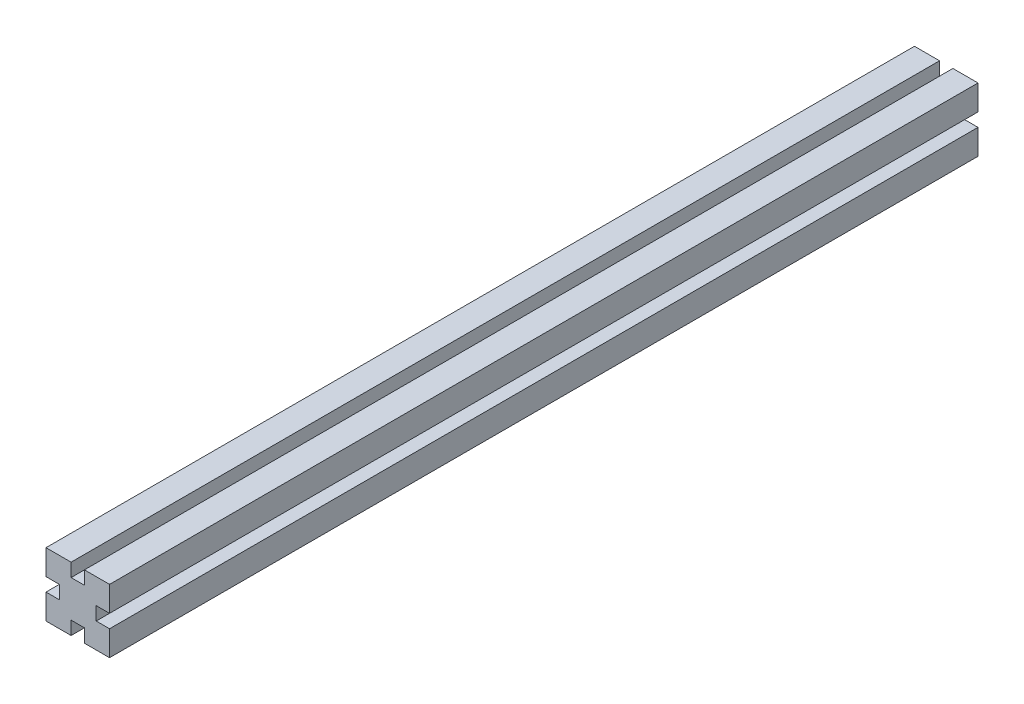
ISO-10303-21;
HEADER;
FILE_DESCRIPTION(('STEP AP214'),'2;1');
FILE_NAME('part.step','',(''),(''),'','','');
FILE_SCHEMA(('AUTOMOTIVE_DESIGN { 1 0 10303 214 1 1 1 1 }'));
ENDSEC;
DATA;
#1=APPLICATION_CONTEXT('core data for automotive mechanical design processes');
#2=APPLICATION_PROTOCOL_DEFINITION('international standard','automotive_design',2000,#1);
#3=PRODUCT_CONTEXT('',#1,'mechanical');
#4=PRODUCT('Part','Part','',(#3));
#5=PRODUCT_RELATED_PRODUCT_CATEGORY('part','',(#4));
#6=PRODUCT_DEFINITION_FORMATION('','',#4);
#7=PRODUCT_DEFINITION_CONTEXT('part definition',#1,'design');
#8=PRODUCT_DEFINITION('design','',#6,#7);
#9=PRODUCT_DEFINITION_SHAPE('','',#8);
#10=(LENGTH_UNIT() NAMED_UNIT(*) SI_UNIT(.MILLI.,.METRE.));
#11=(NAMED_UNIT(*) PLANE_ANGLE_UNIT() SI_UNIT($,.RADIAN.));
#12=(NAMED_UNIT(*) SI_UNIT($,.STERADIAN.) SOLID_ANGLE_UNIT());
#13=UNCERTAINTY_MEASURE_WITH_UNIT(LENGTH_MEASURE(1.E-05),#10,'distance_accuracy_value','');
#14=(GEOMETRIC_REPRESENTATION_CONTEXT(3) GLOBAL_UNCERTAINTY_ASSIGNED_CONTEXT((#13)) GLOBAL_UNIT_ASSIGNED_CONTEXT((#10,
#11,#12)) REPRESENTATION_CONTEXT('',''));
#15=CARTESIAN_POINT('',(0.,0.,0.));
#16=DIRECTION('',(0.,0.,1.));
#17=DIRECTION('',(1.,0.,0.));
#18=AXIS2_PLACEMENT_3D('',#15,#16,#17);
#19=CARTESIAN_POINT('',(-19.05,-4.,520.7));
#20=DIRECTION('',(1.,0.,0.));
#21=DIRECTION('',(0.,0.,-1.));
#22=AXIS2_PLACEMENT_3D('',#19,#20,#21);
#23=PLANE('',#22);
#24=DIRECTION('',(0.,-1.,0.));
#25=VECTOR('',#24,1.);
#26=CARTESIAN_POINT('',(-19.05,-4.,0.));
#27=LINE('',#26,#25);
#28=CARTESIAN_POINT('',(-19.05,-4.,0.));
#29=VERTEX_POINT('',#28);
#30=CARTESIAN_POINT('',(-19.05,-19.05,0.));
#31=VERTEX_POINT('',#30);
#32=EDGE_CURVE('E207',#29,#31,#27,.T.);
#33=ORIENTED_EDGE('',*,*,#32,.T.);
#34=DIRECTION('',(0.,0.,-1.));
#35=VECTOR('',#34,1.);
#36=CARTESIAN_POINT('',(-19.05,-19.05,520.7));
#37=LINE('',#36,#35);
#38=CARTESIAN_POINT('',(-19.05,-19.05,520.7));
#39=VERTEX_POINT('',#38);
#40=EDGE_CURVE('E11',#39,#31,#37,.T.);
#41=ORIENTED_EDGE('',*,*,#40,.F.);
#42=DIRECTION('',(0.,-1.,0.));
#43=VECTOR('',#42,1.);
#44=CARTESIAN_POINT('',(-19.05,-4.,520.7));
#45=LINE('',#44,#43);
#46=CARTESIAN_POINT('',(-19.05,-4.,520.7));
#47=VERTEX_POINT('',#46);
#48=EDGE_CURVE('E245',#47,#39,#45,.T.);
#49=ORIENTED_EDGE('',*,*,#48,.F.);
#50=DIRECTION('',(0.,0.,-1.));
#51=VECTOR('',#50,1.);
#52=CARTESIAN_POINT('',(-19.05,-4.,520.7));
#53=LINE('',#52,#51);
#54=EDGE_CURVE('E203',#47,#29,#53,.T.);
#55=ORIENTED_EDGE('',*,*,#54,.T.);
#56=EDGE_LOOP('',(#33,#41,#49,#55));
#57=FACE_BOUND('',#56,.T.);
#58=ADVANCED_FACE('F39',(#57),#23,.F.);
#59=CARTESIAN_POINT('',(-19.05,-19.05,520.7));
#60=DIRECTION('',(0.,1.,0.));
#61=DIRECTION('',(0.,0.,1.));
#62=AXIS2_PLACEMENT_3D('',#59,#60,#61);
#63=PLANE('',#62);
#64=DIRECTION('',(1.,0.,0.));
#65=VECTOR('',#64,1.);
#66=CARTESIAN_POINT('',(-19.05,-19.05,0.));
#67=LINE('',#66,#65);
#68=CARTESIAN_POINT('',(-4.,-19.05,0.));
#69=VERTEX_POINT('',#68);
#70=EDGE_CURVE('E210',#31,#69,#67,.T.);
#71=ORIENTED_EDGE('',*,*,#70,.T.);
#72=DIRECTION('',(0.,0.,-1.));
#73=VECTOR('',#72,1.);
#74=CARTESIAN_POINT('',(-4.,-19.05,520.7));
#75=LINE('',#74,#73);
#76=CARTESIAN_POINT('',(-4.,-19.05,520.7));
#77=VERTEX_POINT('',#76);
#78=EDGE_CURVE('E47',#77,#69,#75,.T.);
#79=ORIENTED_EDGE('',*,*,#78,.F.);
#80=DIRECTION('',(1.,0.,0.));
#81=VECTOR('',#80,1.);
#82=CARTESIAN_POINT('',(-19.05,-19.05,520.7));
#83=LINE('',#82,#81);
#84=EDGE_CURVE('E134',#39,#77,#83,.T.);
#85=ORIENTED_EDGE('',*,*,#84,.F.);
#86=ORIENTED_EDGE('',*,*,#40,.T.);
#87=EDGE_LOOP('',(#71,#79,#85,#86));
#88=FACE_BOUND('',#87,.T.);
#89=ADVANCED_FACE('F363',(#88),#63,.F.);
#90=CARTESIAN_POINT('',(-4.,-19.05,520.7));
#91=DIRECTION('',(-1.,0.,0.));
#92=DIRECTION('',(0.,0.,1.));
#93=AXIS2_PLACEMENT_3D('',#90,#91,#92);
#94=PLANE('',#93);
#95=DIRECTION('',(0.,1.,0.));
#96=VECTOR('',#95,1.);
#97=CARTESIAN_POINT('',(-4.,-19.05,0.));
#98=LINE('',#97,#96);
#99=CARTESIAN_POINT('',(-4.,-11.05,0.));
#100=VERTEX_POINT('',#99);
#101=EDGE_CURVE('E212',#69,#100,#98,.T.);
#102=ORIENTED_EDGE('',*,*,#101,.T.);
#103=DIRECTION('',(0.,0.,-1.));
#104=VECTOR('',#103,1.);
#105=CARTESIAN_POINT('',(-4.,-11.05,520.7));
#106=LINE('',#105,#104);
#107=CARTESIAN_POINT('',(-4.,-11.05,520.7));
#108=VERTEX_POINT('',#107);
#109=EDGE_CURVE('E288',#108,#100,#106,.T.);
#110=ORIENTED_EDGE('',*,*,#109,.F.);
#111=DIRECTION('',(0.,1.,0.));
#112=VECTOR('',#111,1.);
#113=CARTESIAN_POINT('',(-4.,-19.05,520.7));
#114=LINE('',#113,#112);
#115=EDGE_CURVE('E296',#77,#108,#114,.T.);
#116=ORIENTED_EDGE('',*,*,#115,.F.);
#117=ORIENTED_EDGE('',*,*,#78,.T.);
#118=EDGE_LOOP('',(#102,#110,#116,#117));
#119=FACE_BOUND('',#118,.T.);
#120=ADVANCED_FACE('F294',(#119),#94,.F.);
#121=CARTESIAN_POINT('',(-4.,-11.05,520.7));
#122=DIRECTION('',(0.,1.,0.));
#123=DIRECTION('',(0.,0.,1.));
#124=AXIS2_PLACEMENT_3D('',#121,#122,#123);
#125=PLANE('',#124);
#126=DIRECTION('',(1.,0.,0.));
#127=VECTOR('',#126,1.);
#128=CARTESIAN_POINT('',(-4.,-11.05,0.));
#129=LINE('',#128,#127);
#130=CARTESIAN_POINT('',(4.,-11.05,0.));
#131=VERTEX_POINT('',#130);
#132=EDGE_CURVE('E214',#100,#131,#129,.T.);
#133=ORIENTED_EDGE('',*,*,#132,.T.);
#134=DIRECTION('',(0.,0.,-1.));
#135=VECTOR('',#134,1.);
#136=CARTESIAN_POINT('',(4.,-11.05,520.7));
#137=LINE('',#136,#135);
#138=CARTESIAN_POINT('',(4.,-11.05,520.7));
#139=VERTEX_POINT('',#138);
#140=EDGE_CURVE('E285',#139,#131,#137,.T.);
#141=ORIENTED_EDGE('',*,*,#140,.F.);
#142=DIRECTION('',(1.,0.,0.));
#143=VECTOR('',#142,1.);
#144=CARTESIAN_POINT('',(-4.,-11.05,520.7));
#145=LINE('',#144,#143);
#146=EDGE_CURVE('E314',#108,#139,#145,.T.);
#147=ORIENTED_EDGE('',*,*,#146,.F.);
#148=ORIENTED_EDGE('',*,*,#109,.T.);
#149=EDGE_LOOP('',(#133,#141,#147,#148));
#150=FACE_BOUND('',#149,.T.);
#151=ADVANCED_FACE('F305',(#150),#125,.F.);
#152=CARTESIAN_POINT('',(4.,-11.05,520.7));
#153=DIRECTION('',(1.,0.,0.));
#154=DIRECTION('',(0.,0.,-1.));
#155=AXIS2_PLACEMENT_3D('',#152,#153,#154);
#156=PLANE('',#155);
#157=DIRECTION('',(0.,-1.,0.));
#158=VECTOR('',#157,1.);
#159=CARTESIAN_POINT('',(4.,-11.05,0.));
#160=LINE('',#159,#158);
#161=CARTESIAN_POINT('',(4.,-19.05,0.));
#162=VERTEX_POINT('',#161);
#163=EDGE_CURVE('E216',#131,#162,#160,.T.);
#164=ORIENTED_EDGE('',*,*,#163,.T.);
#165=DIRECTION('',(0.,0.,-1.));
#166=VECTOR('',#165,1.);
#167=CARTESIAN_POINT('',(4.,-19.05,520.7));
#168=LINE('',#167,#166);
#169=CARTESIAN_POINT('',(4.,-19.05,520.7));
#170=VERTEX_POINT('',#169);
#171=EDGE_CURVE('E282',#170,#162,#168,.T.);
#172=ORIENTED_EDGE('',*,*,#171,.F.);
#173=DIRECTION('',(0.,-1.,0.));
#174=VECTOR('',#173,1.);
#175=CARTESIAN_POINT('',(4.,-11.05,520.7));
#176=LINE('',#175,#174);
#177=EDGE_CURVE('E311',#139,#170,#176,.T.);
#178=ORIENTED_EDGE('',*,*,#177,.F.);
#179=ORIENTED_EDGE('',*,*,#140,.T.);
#180=EDGE_LOOP('',(#164,#172,#178,#179));
#181=FACE_BOUND('',#180,.T.);
#182=ADVANCED_FACE('F309',(#181),#156,.F.);
#183=CARTESIAN_POINT('',(4.,-19.05,520.7));
#184=DIRECTION('',(0.,1.,0.));
#185=DIRECTION('',(0.,0.,1.));
#186=AXIS2_PLACEMENT_3D('',#183,#184,#185);
#187=PLANE('',#186);
#188=DIRECTION('',(1.,0.,0.));
#189=VECTOR('',#188,1.);
#190=CARTESIAN_POINT('',(4.,-19.05,0.));
#191=LINE('',#190,#189);
#192=CARTESIAN_POINT('',(19.05,-19.05,0.));
#193=VERTEX_POINT('',#192);
#194=EDGE_CURVE('E218',#162,#193,#191,.T.);
#195=ORIENTED_EDGE('',*,*,#194,.T.);
#196=DIRECTION('',(0.,0.,-1.));
#197=VECTOR('',#196,1.);
#198=CARTESIAN_POINT('',(19.05,-19.05,520.7));
#199=LINE('',#198,#197);
#200=CARTESIAN_POINT('',(19.05,-19.05,520.7));
#201=VERTEX_POINT('',#200);
#202=EDGE_CURVE('E279',#201,#193,#199,.T.);
#203=ORIENTED_EDGE('',*,*,#202,.F.);
#204=DIRECTION('',(1.,0.,0.));
#205=VECTOR('',#204,1.);
#206=CARTESIAN_POINT('',(4.,-19.05,520.7));
#207=LINE('',#206,#205);
#208=EDGE_CURVE('E313',#170,#201,#207,.T.);
#209=ORIENTED_EDGE('',*,*,#208,.F.);
#210=ORIENTED_EDGE('',*,*,#171,.T.);
#211=EDGE_LOOP('',(#195,#203,#209,#210));
#212=FACE_BOUND('',#211,.T.);
#213=ADVANCED_FACE('F376',(#212),#187,.F.);
#214=CARTESIAN_POINT('',(19.05,-19.05,520.7));
#215=DIRECTION('',(-1.,0.,0.));
#216=DIRECTION('',(0.,0.,1.));
#217=AXIS2_PLACEMENT_3D('',#214,#215,#216);
#218=PLANE('',#217);
#219=DIRECTION('',(0.,1.,0.));
#220=VECTOR('',#219,1.);
#221=CARTESIAN_POINT('',(19.05,-19.05,0.));
#222=LINE('',#221,#220);
#223=CARTESIAN_POINT('',(19.05,-4.,0.));
#224=VERTEX_POINT('',#223);
#225=EDGE_CURVE('E220',#193,#224,#222,.T.);
#226=ORIENTED_EDGE('',*,*,#225,.T.);
#227=DIRECTION('',(0.,0.,-1.));
#228=VECTOR('',#227,1.);
#229=CARTESIAN_POINT('',(19.05,-4.,520.7));
#230=LINE('',#229,#228);
#231=CARTESIAN_POINT('',(19.05,-4.,520.7));
#232=VERTEX_POINT('',#231);
#233=EDGE_CURVE('E276',#232,#224,#230,.T.);
#234=ORIENTED_EDGE('',*,*,#233,.F.);
#235=DIRECTION('',(0.,1.,0.));
#236=VECTOR('',#235,1.);
#237=CARTESIAN_POINT('',(19.05,-19.05,520.7));
#238=LINE('',#237,#236);
#239=EDGE_CURVE('E316',#201,#232,#238,.T.);
#240=ORIENTED_EDGE('',*,*,#239,.F.);
#241=ORIENTED_EDGE('',*,*,#202,.T.);
#242=EDGE_LOOP('',(#226,#234,#240,#241));
#243=FACE_BOUND('',#242,.T.);
#244=ADVANCED_FACE('F379',(#243),#218,.F.);
#245=CARTESIAN_POINT('',(19.05,-4.,520.7));
#246=DIRECTION('',(0.,-1.,0.));
#247=DIRECTION('',(0.,0.,-1.));
#248=AXIS2_PLACEMENT_3D('',#245,#246,#247);
#249=PLANE('',#248);
#250=DIRECTION('',(-1.,0.,0.));
#251=VECTOR('',#250,1.);
#252=CARTESIAN_POINT('',(19.05,-4.,0.));
#253=LINE('',#252,#251);
#254=CARTESIAN_POINT('',(11.05,-4.,0.));
#255=VERTEX_POINT('',#254);
#256=EDGE_CURVE('E222',#224,#255,#253,.T.);
#257=ORIENTED_EDGE('',*,*,#256,.T.);
#258=DIRECTION('',(0.,0.,-1.));
#259=VECTOR('',#258,1.);
#260=CARTESIAN_POINT('',(11.05,-4.,520.7));
#261=LINE('',#260,#259);
#262=CARTESIAN_POINT('',(11.05,-4.,520.7));
#263=VERTEX_POINT('',#262);
#264=EDGE_CURVE('E273',#263,#255,#261,.T.);
#265=ORIENTED_EDGE('',*,*,#264,.F.);
#266=DIRECTION('',(-1.,0.,0.));
#267=VECTOR('',#266,1.);
#268=CARTESIAN_POINT('',(19.05,-4.,520.7));
#269=LINE('',#268,#267);
#270=EDGE_CURVE('E322',#232,#263,#269,.T.);
#271=ORIENTED_EDGE('',*,*,#270,.F.);
#272=ORIENTED_EDGE('',*,*,#233,.T.);
#273=EDGE_LOOP('',(#257,#265,#271,#272));
#274=FACE_BOUND('',#273,.T.);
#275=ADVANCED_FACE('F383',(#274),#249,.F.);
#276=CARTESIAN_POINT('',(11.05,-4.,520.7));
#277=DIRECTION('',(-1.,0.,0.));
#278=DIRECTION('',(0.,0.,1.));
#279=AXIS2_PLACEMENT_3D('',#276,#277,#278);
#280=PLANE('',#279);
#281=DIRECTION('',(0.,1.,0.));
#282=VECTOR('',#281,1.);
#283=CARTESIAN_POINT('',(11.05,-4.,0.));
#284=LINE('',#283,#282);
#285=CARTESIAN_POINT('',(11.05,4.,0.));
#286=VERTEX_POINT('',#285);
#287=EDGE_CURVE('E224',#255,#286,#284,.T.);
#288=ORIENTED_EDGE('',*,*,#287,.T.);
#289=DIRECTION('',(0.,0.,-1.));
#290=VECTOR('',#289,1.);
#291=CARTESIAN_POINT('',(11.05,4.,520.7));
#292=LINE('',#291,#290);
#293=CARTESIAN_POINT('',(11.05,4.,520.7));
#294=VERTEX_POINT('',#293);
#295=EDGE_CURVE('E270',#294,#286,#292,.T.);
#296=ORIENTED_EDGE('',*,*,#295,.F.);
#297=DIRECTION('',(0.,1.,0.));
#298=VECTOR('',#297,1.);
#299=CARTESIAN_POINT('',(11.05,-4.,520.7));
#300=LINE('',#299,#298);
#301=EDGE_CURVE('E324',#263,#294,#300,.T.);
#302=ORIENTED_EDGE('',*,*,#301,.F.);
#303=ORIENTED_EDGE('',*,*,#264,.T.);
#304=EDGE_LOOP('',(#288,#296,#302,#303));
#305=FACE_BOUND('',#304,.T.);
#306=ADVANCED_FACE('F387',(#305),#280,.F.);
#307=CARTESIAN_POINT('',(11.05,4.,520.7));
#308=DIRECTION('',(0.,1.,0.));
#309=DIRECTION('',(0.,0.,1.));
#310=AXIS2_PLACEMENT_3D('',#307,#308,#309);
#311=PLANE('',#310);
#312=DIRECTION('',(1.,0.,0.));
#313=VECTOR('',#312,1.);
#314=CARTESIAN_POINT('',(11.05,4.,0.));
#315=LINE('',#314,#313);
#316=CARTESIAN_POINT('',(19.05,4.,0.));
#317=VERTEX_POINT('',#316);
#318=EDGE_CURVE('E226',#286,#317,#315,.T.);
#319=ORIENTED_EDGE('',*,*,#318,.T.);
#320=DIRECTION('',(0.,0.,-1.));
#321=VECTOR('',#320,1.);
#322=CARTESIAN_POINT('',(19.05,4.,520.7));
#323=LINE('',#322,#321);
#324=CARTESIAN_POINT('',(19.05,4.,520.7));
#325=VERTEX_POINT('',#324);
#326=EDGE_CURVE('E267',#325,#317,#323,.T.);
#327=ORIENTED_EDGE('',*,*,#326,.F.);
#328=DIRECTION('',(1.,0.,0.));
#329=VECTOR('',#328,1.);
#330=CARTESIAN_POINT('',(11.05,4.,520.7));
#331=LINE('',#330,#329);
#332=EDGE_CURVE('E326',#294,#325,#331,.T.);
#333=ORIENTED_EDGE('',*,*,#332,.F.);
#334=ORIENTED_EDGE('',*,*,#295,.T.);
#335=EDGE_LOOP('',(#319,#327,#333,#334));
#336=FACE_BOUND('',#335,.T.);
#337=ADVANCED_FACE('F391',(#336),#311,.F.);
#338=CARTESIAN_POINT('',(19.05,4.,520.7));
#339=DIRECTION('',(-1.,0.,0.));
#340=DIRECTION('',(0.,0.,1.));
#341=AXIS2_PLACEMENT_3D('',#338,#339,#340);
#342=PLANE('',#341);
#343=DIRECTION('',(0.,1.,0.));
#344=VECTOR('',#343,1.);
#345=CARTESIAN_POINT('',(19.05,4.,0.));
#346=LINE('',#345,#344);
#347=CARTESIAN_POINT('',(19.05,19.05,0.));
#348=VERTEX_POINT('',#347);
#349=EDGE_CURVE('E228',#317,#348,#346,.T.);
#350=ORIENTED_EDGE('',*,*,#349,.T.);
#351=DIRECTION('',(0.,0.,-1.));
#352=VECTOR('',#351,1.);
#353=CARTESIAN_POINT('',(19.05,19.05,520.7));
#354=LINE('',#353,#352);
#355=CARTESIAN_POINT('',(19.05,19.05,520.7));
#356=VERTEX_POINT('',#355);
#357=EDGE_CURVE('E264',#356,#348,#354,.T.);
#358=ORIENTED_EDGE('',*,*,#357,.F.);
#359=DIRECTION('',(0.,1.,0.));
#360=VECTOR('',#359,1.);
#361=CARTESIAN_POINT('',(19.05,4.,520.7));
#362=LINE('',#361,#360);
#363=EDGE_CURVE('E328',#325,#356,#362,.T.);
#364=ORIENTED_EDGE('',*,*,#363,.F.);
#365=ORIENTED_EDGE('',*,*,#326,.T.);
#366=EDGE_LOOP('',(#350,#358,#364,#365));
#367=FACE_BOUND('',#366,.T.);
#368=ADVANCED_FACE('F395',(#367),#342,.F.);
#369=CARTESIAN_POINT('',(19.05,19.05,520.7));
#370=DIRECTION('',(0.,-1.,0.));
#371=DIRECTION('',(0.,0.,-1.));
#372=AXIS2_PLACEMENT_3D('',#369,#370,#371);
#373=PLANE('',#372);
#374=DIRECTION('',(-1.,0.,0.));
#375=VECTOR('',#374,1.);
#376=CARTESIAN_POINT('',(19.05,19.05,0.));
#377=LINE('',#376,#375);
#378=CARTESIAN_POINT('',(4.,19.05,0.));
#379=VERTEX_POINT('',#378);
#380=EDGE_CURVE('E230',#348,#379,#377,.T.);
#381=ORIENTED_EDGE('',*,*,#380,.T.);
#382=DIRECTION('',(0.,0.,-1.));
#383=VECTOR('',#382,1.);
#384=CARTESIAN_POINT('',(4.,19.05,520.7));
#385=LINE('',#384,#383);
#386=CARTESIAN_POINT('',(4.,19.05,520.7));
#387=VERTEX_POINT('',#386);
#388=EDGE_CURVE('E261',#387,#379,#385,.T.);
#389=ORIENTED_EDGE('',*,*,#388,.F.);
#390=DIRECTION('',(-1.,0.,0.));
#391=VECTOR('',#390,1.);
#392=CARTESIAN_POINT('',(19.05,19.05,520.7));
#393=LINE('',#392,#391);
#394=EDGE_CURVE('E330',#356,#387,#393,.T.);
#395=ORIENTED_EDGE('',*,*,#394,.F.);
#396=ORIENTED_EDGE('',*,*,#357,.T.);
#397=EDGE_LOOP('',(#381,#389,#395,#396));
#398=FACE_BOUND('',#397,.T.);
#399=ADVANCED_FACE('F399',(#398),#373,.F.);
#400=CARTESIAN_POINT('',(4.,19.05,520.7));
#401=DIRECTION('',(1.,0.,0.));
#402=DIRECTION('',(0.,0.,-1.));
#403=AXIS2_PLACEMENT_3D('',#400,#401,#402);
#404=PLANE('',#403);
#405=DIRECTION('',(0.,-1.,0.));
#406=VECTOR('',#405,1.);
#407=CARTESIAN_POINT('',(4.,19.05,0.));
#408=LINE('',#407,#406);
#409=CARTESIAN_POINT('',(4.,11.05,0.));
#410=VERTEX_POINT('',#409);
#411=EDGE_CURVE('E232',#379,#410,#408,.T.);
#412=ORIENTED_EDGE('',*,*,#411,.T.);
#413=DIRECTION('',(0.,0.,-1.));
#414=VECTOR('',#413,1.);
#415=CARTESIAN_POINT('',(4.,11.05,520.7));
#416=LINE('',#415,#414);
#417=CARTESIAN_POINT('',(4.,11.05,520.7));
#418=VERTEX_POINT('',#417);
#419=EDGE_CURVE('E258',#418,#410,#416,.T.);
#420=ORIENTED_EDGE('',*,*,#419,.F.);
#421=DIRECTION('',(0.,-1.,0.));
#422=VECTOR('',#421,1.);
#423=CARTESIAN_POINT('',(4.,19.05,520.7));
#424=LINE('',#423,#422);
#425=EDGE_CURVE('E332',#387,#418,#424,.T.);
#426=ORIENTED_EDGE('',*,*,#425,.F.);
#427=ORIENTED_EDGE('',*,*,#388,.T.);
#428=EDGE_LOOP('',(#412,#420,#426,#427));
#429=FACE_BOUND('',#428,.T.);
#430=ADVANCED_FACE('F403',(#429),#404,.F.);
#431=CARTESIAN_POINT('',(4.,11.05,520.7));
#432=DIRECTION('',(0.,-1.,0.));
#433=DIRECTION('',(0.,0.,-1.));
#434=AXIS2_PLACEMENT_3D('',#431,#432,#433);
#435=PLANE('',#434);
#436=DIRECTION('',(-1.,0.,0.));
#437=VECTOR('',#436,1.);
#438=CARTESIAN_POINT('',(4.,11.05,0.));
#439=LINE('',#438,#437);
#440=CARTESIAN_POINT('',(-4.,11.05,0.));
#441=VERTEX_POINT('',#440);
#442=EDGE_CURVE('E234',#410,#441,#439,.T.);
#443=ORIENTED_EDGE('',*,*,#442,.T.);
#444=DIRECTION('',(0.,0.,-1.));
#445=VECTOR('',#444,1.);
#446=CARTESIAN_POINT('',(-4.,11.05,520.7));
#447=LINE('',#446,#445);
#448=CARTESIAN_POINT('',(-4.,11.05,520.7));
#449=VERTEX_POINT('',#448);
#450=EDGE_CURVE('E255',#449,#441,#447,.T.);
#451=ORIENTED_EDGE('',*,*,#450,.F.);
#452=DIRECTION('',(-1.,0.,0.));
#453=VECTOR('',#452,1.);
#454=CARTESIAN_POINT('',(4.,11.05,520.7));
#455=LINE('',#454,#453);
#456=EDGE_CURVE('E334',#418,#449,#455,.T.);
#457=ORIENTED_EDGE('',*,*,#456,.F.);
#458=ORIENTED_EDGE('',*,*,#419,.T.);
#459=EDGE_LOOP('',(#443,#451,#457,#458));
#460=FACE_BOUND('',#459,.T.);
#461=ADVANCED_FACE('F407',(#460),#435,.F.);
#462=CARTESIAN_POINT('',(-4.,11.05,520.7));
#463=DIRECTION('',(-1.,0.,0.));
#464=DIRECTION('',(0.,0.,1.));
#465=AXIS2_PLACEMENT_3D('',#462,#463,#464);
#466=PLANE('',#465);
#467=DIRECTION('',(0.,1.,0.));
#468=VECTOR('',#467,1.);
#469=CARTESIAN_POINT('',(-4.,11.05,0.));
#470=LINE('',#469,#468);
#471=CARTESIAN_POINT('',(-4.,19.05,0.));
#472=VERTEX_POINT('',#471);
#473=EDGE_CURVE('E236',#441,#472,#470,.T.);
#474=ORIENTED_EDGE('',*,*,#473,.T.);
#475=DIRECTION('',(0.,0.,-1.));
#476=VECTOR('',#475,1.);
#477=CARTESIAN_POINT('',(-4.,19.05,520.7));
#478=LINE('',#477,#476);
#479=CARTESIAN_POINT('',(-4.,19.05,520.7));
#480=VERTEX_POINT('',#479);
#481=EDGE_CURVE('E252',#480,#472,#478,.T.);
#482=ORIENTED_EDGE('',*,*,#481,.F.);
#483=DIRECTION('',(0.,1.,0.));
#484=VECTOR('',#483,1.);
#485=CARTESIAN_POINT('',(-4.,11.05,520.7));
#486=LINE('',#485,#484);
#487=EDGE_CURVE('E336',#449,#480,#486,.T.);
#488=ORIENTED_EDGE('',*,*,#487,.F.);
#489=ORIENTED_EDGE('',*,*,#450,.T.);
#490=EDGE_LOOP('',(#474,#482,#488,#489));
#491=FACE_BOUND('',#490,.T.);
#492=ADVANCED_FACE('F411',(#491),#466,.F.);
#493=CARTESIAN_POINT('',(-4.,19.05,520.7));
#494=DIRECTION('',(0.,-1.,0.));
#495=DIRECTION('',(0.,0.,-1.));
#496=AXIS2_PLACEMENT_3D('',#493,#494,#495);
#497=PLANE('',#496);
#498=DIRECTION('',(-1.,0.,0.));
#499=VECTOR('',#498,1.);
#500=CARTESIAN_POINT('',(-4.,19.05,0.));
#501=LINE('',#500,#499);
#502=CARTESIAN_POINT('',(-19.05,19.05,0.));
#503=VERTEX_POINT('',#502);
#504=EDGE_CURVE('E238',#472,#503,#501,.T.);
#505=ORIENTED_EDGE('',*,*,#504,.T.);
#506=DIRECTION('',(0.,0.,-1.));
#507=VECTOR('',#506,1.);
#508=CARTESIAN_POINT('',(-19.05,19.05,520.7));
#509=LINE('',#508,#507);
#510=CARTESIAN_POINT('',(-19.05,19.05,520.7));
#511=VERTEX_POINT('',#510);
#512=EDGE_CURVE('E249',#511,#503,#509,.T.);
#513=ORIENTED_EDGE('',*,*,#512,.F.);
#514=DIRECTION('',(-1.,0.,0.));
#515=VECTOR('',#514,1.);
#516=CARTESIAN_POINT('',(-4.,19.05,520.7));
#517=LINE('',#516,#515);
#518=EDGE_CURVE('E338',#480,#511,#517,.T.);
#519=ORIENTED_EDGE('',*,*,#518,.F.);
#520=ORIENTED_EDGE('',*,*,#481,.T.);
#521=EDGE_LOOP('',(#505,#513,#519,#520));
#522=FACE_BOUND('',#521,.T.);
#523=ADVANCED_FACE('F344',(#522),#497,.F.);
#524=CARTESIAN_POINT('',(-19.05,19.05,520.7));
#525=DIRECTION('',(1.,0.,0.));
#526=DIRECTION('',(0.,0.,-1.));
#527=AXIS2_PLACEMENT_3D('',#524,#525,#526);
#528=PLANE('',#527);
#529=DIRECTION('',(0.,-1.,0.));
#530=VECTOR('',#529,1.);
#531=CARTESIAN_POINT('',(-19.05,19.05,0.));
#532=LINE('',#531,#530);
#533=CARTESIAN_POINT('',(-19.05,4.,0.));
#534=VERTEX_POINT('',#533);
#535=EDGE_CURVE('E240',#503,#534,#532,.T.);
#536=ORIENTED_EDGE('',*,*,#535,.T.);
#537=DIRECTION('',(0.,0.,-1.));
#538=VECTOR('',#537,1.);
#539=CARTESIAN_POINT('',(-19.05,4.,520.7));
#540=LINE('',#539,#538);
#541=CARTESIAN_POINT('',(-19.05,4.,520.7));
#542=VERTEX_POINT('',#541);
#543=EDGE_CURVE('E198',#542,#534,#540,.T.);
#544=ORIENTED_EDGE('',*,*,#543,.F.);
#545=DIRECTION('',(0.,-1.,0.));
#546=VECTOR('',#545,1.);
#547=CARTESIAN_POINT('',(-19.05,19.05,520.7));
#548=LINE('',#547,#546);
#549=EDGE_CURVE('E189',#511,#542,#548,.T.);
#550=ORIENTED_EDGE('',*,*,#549,.F.);
#551=ORIENTED_EDGE('',*,*,#512,.T.);
#552=EDGE_LOOP('',(#536,#544,#550,#551));
#553=FACE_BOUND('',#552,.T.);
#554=ADVANCED_FACE('F348',(#553),#528,.F.);
#555=CARTESIAN_POINT('',(-19.05,4.,520.7));
#556=DIRECTION('',(0.,1.,0.));
#557=DIRECTION('',(0.,0.,1.));
#558=AXIS2_PLACEMENT_3D('',#555,#556,#557);
#559=PLANE('',#558);
#560=DIRECTION('',(1.,0.,0.));
#561=VECTOR('',#560,1.);
#562=CARTESIAN_POINT('',(-19.05,4.,0.));
#563=LINE('',#562,#561);
#564=CARTESIAN_POINT('',(-11.05,4.,0.));
#565=VERTEX_POINT('',#564);
#566=EDGE_CURVE('E197',#534,#565,#563,.T.);
#567=ORIENTED_EDGE('',*,*,#566,.T.);
#568=DIRECTION('',(0.,0.,-1.));
#569=VECTOR('',#568,1.);
#570=CARTESIAN_POINT('',(-11.05,4.,520.7));
#571=LINE('',#570,#569);
#572=CARTESIAN_POINT('',(-11.05,4.,520.7));
#573=VERTEX_POINT('',#572);
#574=EDGE_CURVE('E194',#573,#565,#571,.T.);
#575=ORIENTED_EDGE('',*,*,#574,.F.);
#576=DIRECTION('',(1.,0.,0.));
#577=VECTOR('',#576,1.);
#578=CARTESIAN_POINT('',(-19.05,4.,520.7));
#579=LINE('',#578,#577);
#580=EDGE_CURVE('E183',#542,#573,#579,.T.);
#581=ORIENTED_EDGE('',*,*,#580,.F.);
#582=ORIENTED_EDGE('',*,*,#543,.T.);
#583=EDGE_LOOP('',(#567,#575,#581,#582));
#584=FACE_BOUND('',#583,.T.);
#585=ADVANCED_FACE('F195',(#584),#559,.F.);
#586=CARTESIAN_POINT('',(-11.05,4.,520.7));
#587=DIRECTION('',(1.,0.,0.));
#588=DIRECTION('',(0.,0.,-1.));
#589=AXIS2_PLACEMENT_3D('',#586,#587,#588);
#590=PLANE('',#589);
#591=DIRECTION('',(0.,-1.,0.));
#592=VECTOR('',#591,1.);
#593=CARTESIAN_POINT('',(-11.05,4.,0.));
#594=LINE('',#593,#592);
#595=CARTESIAN_POINT('',(-11.05,-4.,0.));
#596=VERTEX_POINT('',#595);
#597=EDGE_CURVE('E120',#565,#596,#594,.T.);
#598=ORIENTED_EDGE('',*,*,#597,.T.);
#599=DIRECTION('',(0.,0.,-1.));
#600=VECTOR('',#599,1.);
#601=CARTESIAN_POINT('',(-11.05,-4.,520.7));
#602=LINE('',#601,#600);
#603=CARTESIAN_POINT('',(-11.05,-4.,520.7));
#604=VERTEX_POINT('',#603);
#605=EDGE_CURVE('E199',#604,#596,#602,.T.);
#606=ORIENTED_EDGE('',*,*,#605,.F.);
#607=DIRECTION('',(0.,-1.,0.));
#608=VECTOR('',#607,1.);
#609=CARTESIAN_POINT('',(-11.05,4.,520.7));
#610=LINE('',#609,#608);
#611=EDGE_CURVE('E187',#573,#604,#610,.T.);
#612=ORIENTED_EDGE('',*,*,#611,.F.);
#613=ORIENTED_EDGE('',*,*,#574,.T.);
#614=EDGE_LOOP('',(#598,#606,#612,#613));
#615=FACE_BOUND('',#614,.T.);
#616=ADVANCED_FACE('F201',(#615),#590,.F.);
#617=CARTESIAN_POINT('',(-11.05,-4.,520.7));
#618=DIRECTION('',(0.,-1.,0.));
#619=DIRECTION('',(0.,0.,-1.));
#620=AXIS2_PLACEMENT_3D('',#617,#618,#619);
#621=PLANE('',#620);
#622=DIRECTION('',(-1.,0.,0.));
#623=VECTOR('',#622,1.);
#624=CARTESIAN_POINT('',(-11.05,-4.,0.));
#625=LINE('',#624,#623);
#626=EDGE_CURVE('E126',#596,#29,#625,.T.);
#627=ORIENTED_EDGE('',*,*,#626,.T.);
#628=ORIENTED_EDGE('',*,*,#54,.F.);
#629=DIRECTION('',(-1.,0.,0.));
#630=VECTOR('',#629,1.);
#631=CARTESIAN_POINT('',(-11.05,-4.,520.7));
#632=LINE('',#631,#630);
#633=EDGE_CURVE('E55',#604,#47,#632,.T.);
#634=ORIENTED_EDGE('',*,*,#633,.F.);
#635=ORIENTED_EDGE('',*,*,#605,.T.);
#636=EDGE_LOOP('',(#627,#628,#634,#635));
#637=FACE_BOUND('',#636,.T.);
#638=ADVANCED_FACE('F352',(#637),#621,.F.);
#639=CARTESIAN_POINT('',(0.,0.,520.7));
#640=DIRECTION('',(0.,0.,1.));
#641=DIRECTION('',(1.,0.,0.));
#642=AXIS2_PLACEMENT_3D('',#639,#640,#641);
#643=PLANE('',#642);
#644=ORIENTED_EDGE('',*,*,#48,.T.);
#645=ORIENTED_EDGE('',*,*,#84,.T.);
#646=ORIENTED_EDGE('',*,*,#115,.T.);
#647=ORIENTED_EDGE('',*,*,#146,.T.);
#648=ORIENTED_EDGE('',*,*,#177,.T.);
#649=ORIENTED_EDGE('',*,*,#208,.T.);
#650=ORIENTED_EDGE('',*,*,#239,.T.);
#651=ORIENTED_EDGE('',*,*,#270,.T.);
#652=ORIENTED_EDGE('',*,*,#301,.T.);
#653=ORIENTED_EDGE('',*,*,#332,.T.);
#654=ORIENTED_EDGE('',*,*,#363,.T.);
#655=ORIENTED_EDGE('',*,*,#394,.T.);
#656=ORIENTED_EDGE('',*,*,#425,.T.);
#657=ORIENTED_EDGE('',*,*,#456,.T.);
#658=ORIENTED_EDGE('',*,*,#487,.T.);
#659=ORIENTED_EDGE('',*,*,#518,.T.);
#660=ORIENTED_EDGE('',*,*,#549,.T.);
#661=ORIENTED_EDGE('',*,*,#580,.T.);
#662=ORIENTED_EDGE('',*,*,#611,.T.);
#663=ORIENTED_EDGE('',*,*,#633,.T.);
#664=EDGE_LOOP('',(#644,#645,#646,#647,#648,#649,#650,#651,#652,#653,#654,#655,#656,#657,#658,
#659,#660,#661,#662,#663));
#665=FACE_BOUND('',#664,.T.);
#666=ADVANCED_FACE('F185',(#665),#643,.T.);
#667=CARTESIAN_POINT('',(0.,0.,0.));
#668=DIRECTION('',(0.,0.,1.));
#669=DIRECTION('',(1.,0.,0.));
#670=AXIS2_PLACEMENT_3D('',#667,#668,#669);
#671=PLANE('',#670);
#672=ORIENTED_EDGE('',*,*,#32,.F.);
#673=ORIENTED_EDGE('',*,*,#626,.F.);
#674=ORIENTED_EDGE('',*,*,#597,.F.);
#675=ORIENTED_EDGE('',*,*,#566,.F.);
#676=ORIENTED_EDGE('',*,*,#535,.F.);
#677=ORIENTED_EDGE('',*,*,#504,.F.);
#678=ORIENTED_EDGE('',*,*,#473,.F.);
#679=ORIENTED_EDGE('',*,*,#442,.F.);
#680=ORIENTED_EDGE('',*,*,#411,.F.);
#681=ORIENTED_EDGE('',*,*,#380,.F.);
#682=ORIENTED_EDGE('',*,*,#349,.F.);
#683=ORIENTED_EDGE('',*,*,#318,.F.);
#684=ORIENTED_EDGE('',*,*,#287,.F.);
#685=ORIENTED_EDGE('',*,*,#256,.F.);
#686=ORIENTED_EDGE('',*,*,#225,.F.);
#687=ORIENTED_EDGE('',*,*,#194,.F.);
#688=ORIENTED_EDGE('',*,*,#163,.F.);
#689=ORIENTED_EDGE('',*,*,#132,.F.);
#690=ORIENTED_EDGE('',*,*,#101,.F.);
#691=ORIENTED_EDGE('',*,*,#70,.F.);
#692=EDGE_LOOP('',(#672,#673,#674,#675,#676,#677,#678,#679,#680,#681,#682,#683,#684,#685,#686,
#687,#688,#689,#690,#691));
#693=FACE_BOUND('',#692,.T.);
#694=ADVANCED_FACE('F300',(#693),#671,.F.);
#695=CLOSED_SHELL('',(#58,#89,#120,#151,#182,#213,#244,#275,#306,#337,#368,#399,#430,#461,#492,
#523,#554,#585,#616,#638,#666,#694));
#696=MANIFOLD_SOLID_BREP('B2',#695);
#697=ADVANCED_BREP_SHAPE_REPRESENTATION('',(#18,#696),#14);
#698=SHAPE_DEFINITION_REPRESENTATION(#9,#697);
ENDSEC;
END-ISO-10303-21;
